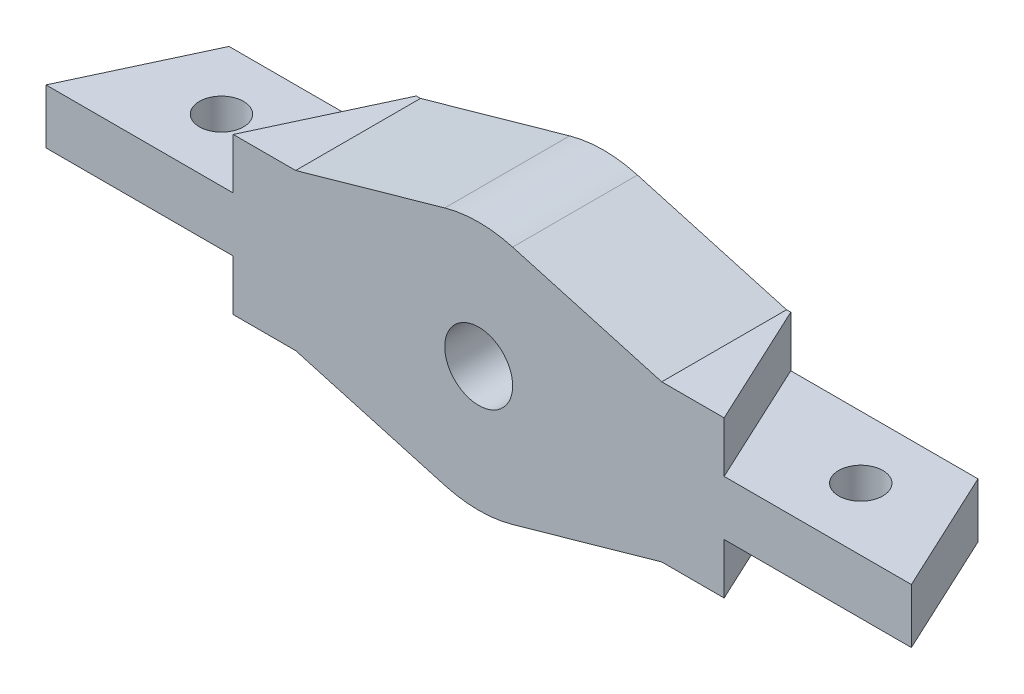
ISO-10303-21;
HEADER;
FILE_DESCRIPTION(('STEP AP214'),'2;1');
FILE_NAME('part.step','',(''),(''),'','','');
FILE_SCHEMA(('AUTOMOTIVE_DESIGN { 1 0 10303 214 1 1 1 1 }'));
ENDSEC;
DATA;
#1=APPLICATION_CONTEXT('core data for automotive mechanical design processes');
#2=APPLICATION_PROTOCOL_DEFINITION('international standard','automotive_design',2000,#1);
#3=PRODUCT_CONTEXT('',#1,'mechanical');
#4=PRODUCT('Part','Part','',(#3));
#5=PRODUCT_RELATED_PRODUCT_CATEGORY('part','',(#4));
#6=PRODUCT_DEFINITION_FORMATION('','',#4);
#7=PRODUCT_DEFINITION_CONTEXT('part definition',#1,'design');
#8=PRODUCT_DEFINITION('design','',#6,#7);
#9=PRODUCT_DEFINITION_SHAPE('','',#8);
#10=(LENGTH_UNIT() NAMED_UNIT(*) SI_UNIT(.MILLI.,.METRE.));
#11=(NAMED_UNIT(*) PLANE_ANGLE_UNIT() SI_UNIT($,.RADIAN.));
#12=(NAMED_UNIT(*) SI_UNIT($,.STERADIAN.) SOLID_ANGLE_UNIT());
#13=UNCERTAINTY_MEASURE_WITH_UNIT(LENGTH_MEASURE(1.E-05),#10,'distance_accuracy_value','');
#14=(GEOMETRIC_REPRESENTATION_CONTEXT(3) GLOBAL_UNCERTAINTY_ASSIGNED_CONTEXT((#13)) GLOBAL_UNIT_ASSIGNED_CONTEXT((#10,
#11,#12)) REPRESENTATION_CONTEXT('',''));
#15=CARTESIAN_POINT('',(0.,0.,0.));
#16=DIRECTION('',(0.,0.,1.));
#17=DIRECTION('',(1.,0.,0.));
#18=AXIS2_PLACEMENT_3D('',#15,#16,#17);
#19=CARTESIAN_POINT('',(24.9721072585685,12.7,6.34999999999999));
#20=DIRECTION('',(0.,0.,-1.));
#21=DIRECTION('',(-1.,0.,0.));
#22=AXIS2_PLACEMENT_3D('',#19,#20,#21);
#23=PLANE('',#22);
#24=CARTESIAN_POINT('',(0.,0.,6.34999999999999));
#25=DIRECTION('',(0.,0.,1.));
#26=DIRECTION('',(1.,0.,0.));
#27=AXIS2_PLACEMENT_3D('',#24,#25,#26);
#28=CIRCLE('',#27,3.4544);
#29=CARTESIAN_POINT('',(3.4544,0.,6.34999999999999));
#30=VERTEX_POINT('',#29);
#31=EDGE_CURVE('E385',#30,#30,#28,.T.);
#32=ORIENTED_EDGE('',*,*,#31,.F.);
#33=EDGE_LOOP('',(#32));
#34=FACE_BOUND('',#33,.T.);
#35=CARTESIAN_POINT('',(0.,0.,6.34999999999999));
#36=DIRECTION('',(0.,0.,-1.));
#37=DIRECTION('',(1.,0.,0.));
#38=AXIS2_PLACEMENT_3D('',#35,#36,#37);
#39=CIRCLE('',#38,12.7);
#40=CARTESIAN_POINT('',(3.45172685795644,-12.2219303589107,6.34999999999999));
#41=VERTEX_POINT('',#40);
#42=CARTESIAN_POINT('',(-3.45172685795644,-12.2219303589107,6.34999999999999));
#43=VERTEX_POINT('',#42);
#44=EDGE_CURVE('E233',#41,#43,#39,.T.);
#45=ORIENTED_EDGE('',*,*,#44,.F.);
#46=DIRECTION('',(-0.962356721174068,-0.271789516374523,0.));
#47=VECTOR('',#46,1.);
#48=CARTESIAN_POINT('',(3.45172685795644,-12.2219303589107,6.34999999999999));
#49=LINE('',#48,#47);
#50=CARTESIAN_POINT('',(18.6221072585685,-7.9375,6.34999999999999));
#51=VERTEX_POINT('',#50);
#52=EDGE_CURVE('E205',#51,#41,#49,.T.);
#53=ORIENTED_EDGE('',*,*,#52,.F.);
#54=DIRECTION('',(-1.,0.,0.));
#55=VECTOR('',#54,1.);
#56=CARTESIAN_POINT('',(0.,-7.9375,6.34999999999999));
#57=LINE('',#56,#55);
#58=CARTESIAN_POINT('',(24.9721072585685,-7.9375,6.34999999999999));
#59=VERTEX_POINT('',#58);
#60=EDGE_CURVE('E185',#59,#51,#57,.T.);
#61=ORIENTED_EDGE('',*,*,#60,.F.);
#62=DIRECTION('',(0.,-1.,0.));
#63=VECTOR('',#62,1.);
#64=CARTESIAN_POINT('',(24.9721072585685,12.7,6.34999999999999));
#65=LINE('',#64,#63);
#66=CARTESIAN_POINT('',(24.9721072585685,-2.778125,6.34999999999999));
#67=VERTEX_POINT('',#66);
#68=EDGE_CURVE('E399',#67,#59,#65,.T.);
#69=ORIENTED_EDGE('',*,*,#68,.F.);
#70=DIRECTION('',(1.,0.,0.));
#71=VECTOR('',#70,1.);
#72=CARTESIAN_POINT('',(24.9721072585685,-2.778125,6.34999999999999));
#73=LINE('',#72,#71);
#74=CARTESIAN_POINT('',(44.0221072585685,-2.778125,6.34999999999999));
#75=VERTEX_POINT('',#74);
#76=EDGE_CURVE('E329',#67,#75,#73,.T.);
#77=ORIENTED_EDGE('',*,*,#76,.T.);
#78=DIRECTION('',(0.,1.,0.));
#79=VECTOR('',#78,1.);
#80=CARTESIAN_POINT('',(44.0221072585685,-2.778125,6.34999999999999));
#81=LINE('',#80,#79);
#82=CARTESIAN_POINT('',(44.0221072585685,2.778125,6.34999999999999));
#83=VERTEX_POINT('',#82);
#84=EDGE_CURVE('E301',#75,#83,#81,.T.);
#85=ORIENTED_EDGE('',*,*,#84,.T.);
#86=DIRECTION('',(-1.,0.,0.));
#87=VECTOR('',#86,1.);
#88=CARTESIAN_POINT('',(24.9721072585685,2.778125,6.34999999999999));
#89=LINE('',#88,#87);
#90=CARTESIAN_POINT('',(24.9721072585685,2.778125,6.34999999999999));
#91=VERTEX_POINT('',#90);
#92=EDGE_CURVE('E316',#83,#91,#89,.T.);
#93=ORIENTED_EDGE('',*,*,#92,.T.);
#94=CARTESIAN_POINT('',(24.9721072585685,7.9375,6.34999999999999));
#95=VERTEX_POINT('',#94);
#96=EDGE_CURVE('E400',#95,#91,#65,.T.);
#97=ORIENTED_EDGE('',*,*,#96,.F.);
#98=DIRECTION('',(-1.,0.,0.));
#99=VECTOR('',#98,1.);
#100=CARTESIAN_POINT('',(0.,7.9375,6.34999999999999));
#101=LINE('',#100,#99);
#102=CARTESIAN_POINT('',(18.6221072585685,7.9375,6.34999999999999));
#103=VERTEX_POINT('',#102);
#104=EDGE_CURVE('E220',#95,#103,#101,.T.);
#105=ORIENTED_EDGE('',*,*,#104,.T.);
#106=DIRECTION('',(-0.962356721174068,0.271789516374523,0.));
#107=VECTOR('',#106,1.);
#108=CARTESIAN_POINT('',(3.45172685795644,12.2219303589107,6.34999999999999));
#109=LINE('',#108,#107);
#110=CARTESIAN_POINT('',(3.45172685795644,12.2219303589107,6.34999999999999));
#111=VERTEX_POINT('',#110);
#112=EDGE_CURVE('E213',#103,#111,#109,.T.);
#113=ORIENTED_EDGE('',*,*,#112,.T.);
#114=CARTESIAN_POINT('',(0.,0.,6.34999999999999));
#115=DIRECTION('',(0.,0.,1.));
#116=DIRECTION('',(1.,0.,0.));
#117=AXIS2_PLACEMENT_3D('',#114,#115,#116);
#118=CIRCLE('',#117,12.7);
#119=CARTESIAN_POINT('',(-3.45172685795644,12.2219303589107,6.34999999999999));
#120=VERTEX_POINT('',#119);
#121=EDGE_CURVE('E261',#111,#120,#118,.T.);
#122=ORIENTED_EDGE('',*,*,#121,.T.);
#123=DIRECTION('',(0.962356721174068,0.271789516374523,0.));
#124=VECTOR('',#123,1.);
#125=CARTESIAN_POINT('',(-3.45172685795644,12.2219303589107,6.34999999999999));
#126=LINE('',#125,#124);
#127=CARTESIAN_POINT('',(-18.6221072585685,7.9375,6.34999999999999));
#128=VERTEX_POINT('',#127);
#129=EDGE_CURVE('E268',#128,#120,#126,.T.);
#130=ORIENTED_EDGE('',*,*,#129,.F.);
#131=DIRECTION('',(1.,0.,0.));
#132=VECTOR('',#131,1.);
#133=CARTESIAN_POINT('',(0.,7.9375,6.34999999999999));
#134=LINE('',#133,#132);
#135=CARTESIAN_POINT('',(-24.9721072585685,7.9375,6.34999999999999));
#136=VERTEX_POINT('',#135);
#137=EDGE_CURVE('E280',#136,#128,#134,.T.);
#138=ORIENTED_EDGE('',*,*,#137,.F.);
#139=DIRECTION('',(0.,-1.,0.));
#140=VECTOR('',#139,1.);
#141=CARTESIAN_POINT('',(-24.9721072585685,12.7,6.35));
#142=LINE('',#141,#140);
#143=CARTESIAN_POINT('',(-24.9721072585685,2.778125,6.35));
#144=VERTEX_POINT('',#143);
#145=EDGE_CURVE('E404',#136,#144,#142,.T.);
#146=ORIENTED_EDGE('',*,*,#145,.T.);
#147=DIRECTION('',(-1.,0.,0.));
#148=VECTOR('',#147,1.);
#149=CARTESIAN_POINT('',(-24.9721072585685,2.778125,6.34999999999999));
#150=LINE('',#149,#148);
#151=CARTESIAN_POINT('',(-44.0221072585685,2.778125,6.35));
#152=VERTEX_POINT('',#151);
#153=EDGE_CURVE('E354',#144,#152,#150,.T.);
#154=ORIENTED_EDGE('',*,*,#153,.T.);
#155=DIRECTION('',(0.,-1.,0.));
#156=VECTOR('',#155,1.);
#157=CARTESIAN_POINT('',(-44.0221072585685,-2.778125,6.34999999999999));
#158=LINE('',#157,#156);
#159=CARTESIAN_POINT('',(-44.0221072585685,-2.778125,6.35));
#160=VERTEX_POINT('',#159);
#161=EDGE_CURVE('E368',#152,#160,#158,.T.);
#162=ORIENTED_EDGE('',*,*,#161,.T.);
#163=DIRECTION('',(1.,0.,0.));
#164=VECTOR('',#163,1.);
#165=CARTESIAN_POINT('',(-24.9721072585685,-2.778125,6.34999999999999));
#166=LINE('',#165,#164);
#167=CARTESIAN_POINT('',(-24.9721072585685,-2.778125,6.35));
#168=VERTEX_POINT('',#167);
#169=EDGE_CURVE('E378',#160,#168,#166,.T.);
#170=ORIENTED_EDGE('',*,*,#169,.T.);
#171=CARTESIAN_POINT('',(-24.9721072585685,-7.9375,6.34999999999999));
#172=VERTEX_POINT('',#171);
#173=EDGE_CURVE('E403',#168,#172,#142,.T.);
#174=ORIENTED_EDGE('',*,*,#173,.T.);
#175=DIRECTION('',(1.,0.,0.));
#176=VECTOR('',#175,1.);
#177=CARTESIAN_POINT('',(0.,-7.9375,6.34999999999999));
#178=LINE('',#177,#176);
#179=CARTESIAN_POINT('',(-18.6221072585685,-7.9375,6.34999999999999));
#180=VERTEX_POINT('',#179);
#181=EDGE_CURVE('E241',#172,#180,#178,.T.);
#182=ORIENTED_EDGE('',*,*,#181,.T.);
#183=DIRECTION('',(0.962356721174068,-0.271789516374523,0.));
#184=VECTOR('',#183,1.);
#185=CARTESIAN_POINT('',(-3.45172685795644,-12.2219303589107,6.34999999999999));
#186=LINE('',#185,#184);
#187=EDGE_CURVE('E251',#180,#43,#186,.T.);
#188=ORIENTED_EDGE('',*,*,#187,.T.);
#189=EDGE_LOOP('',(#45,#53,#61,#69,#77,#85,#93,#97,#105,#113,#122,#130,#138,#146,#154,#162,#170,
#174,#182,#188));
#190=FACE_BOUND('',#189,.T.);
#191=ADVANCED_FACE('F39',(#34,#190),#23,.F.);
#192=CARTESIAN_POINT('',(-19.05,12.7,-6.34999999999999));
#193=DIRECTION('',(0.,0.,1.));
#194=DIRECTION('',(1.,0.,0.));
#195=AXIS2_PLACEMENT_3D('',#192,#193,#194);
#196=PLANE('',#195);
#197=CARTESIAN_POINT('',(0.,0.,-6.34999999999999));
#198=DIRECTION('',(0.,0.,1.));
#199=DIRECTION('',(1.,0.,0.));
#200=AXIS2_PLACEMENT_3D('',#197,#198,#199);
#201=CIRCLE('',#200,3.4544);
#202=CARTESIAN_POINT('',(3.4544,0.,-6.34999999999999));
#203=VERTEX_POINT('',#202);
#204=EDGE_CURVE('E386',#203,#203,#201,.T.);
#205=ORIENTED_EDGE('',*,*,#204,.T.);
#206=EDGE_LOOP('',(#205));
#207=FACE_BOUND('',#206,.T.);
#208=DIRECTION('',(-0.962356721174068,-0.271789516374523,0.));
#209=VECTOR('',#208,1.);
#210=CARTESIAN_POINT('',(3.45172685795644,-12.2219303589107,-6.34999999999999));
#211=LINE('',#210,#209);
#212=CARTESIAN_POINT('',(18.6221072585685,-7.9375,-6.34999999999999));
#213=VERTEX_POINT('',#212);
#214=CARTESIAN_POINT('',(3.45172685795644,-12.2219303589107,-6.34999999999999));
#215=VERTEX_POINT('',#214);
#216=EDGE_CURVE('E191',#213,#215,#211,.T.);
#217=ORIENTED_EDGE('',*,*,#216,.T.);
#218=CARTESIAN_POINT('',(0.,0.,-6.34999999999999));
#219=DIRECTION('',(0.,0.,-1.));
#220=DIRECTION('',(1.,0.,0.));
#221=AXIS2_PLACEMENT_3D('',#218,#219,#220);
#222=CIRCLE('',#221,12.7);
#223=CARTESIAN_POINT('',(-3.45172685795644,-12.2219303589107,-6.34999999999999));
#224=VERTEX_POINT('',#223);
#225=EDGE_CURVE('E237',#215,#224,#222,.T.);
#226=ORIENTED_EDGE('',*,*,#225,.T.);
#227=DIRECTION('',(0.962356721174068,-0.271789516374523,0.));
#228=VECTOR('',#227,1.);
#229=CARTESIAN_POINT('',(-3.45172685795644,-12.2219303589107,-6.34999999999999));
#230=LINE('',#229,#228);
#231=CARTESIAN_POINT('',(-18.6221072585685,-7.9375,-6.34999999999999));
#232=VERTEX_POINT('',#231);
#233=EDGE_CURVE('E240',#232,#224,#230,.T.);
#234=ORIENTED_EDGE('',*,*,#233,.F.);
#235=DIRECTION('',(1.,0.,0.));
#236=VECTOR('',#235,1.);
#237=CARTESIAN_POINT('',(0.,-7.9375,-6.34999999999999));
#238=LINE('',#237,#236);
#239=CARTESIAN_POINT('',(-19.05,-7.9375,-6.34999999999999));
#240=VERTEX_POINT('',#239);
#241=EDGE_CURVE('E244',#240,#232,#238,.T.);
#242=ORIENTED_EDGE('',*,*,#241,.F.);
#243=DIRECTION('',(0.,-1.,0.));
#244=VECTOR('',#243,1.);
#245=CARTESIAN_POINT('',(-19.05,12.7,-6.34999999999999));
#246=LINE('',#245,#244);
#247=CARTESIAN_POINT('',(-19.05,-2.778125,-6.34999999999999));
#248=VERTEX_POINT('',#247);
#249=EDGE_CURVE('E390',#248,#240,#246,.T.);
#250=ORIENTED_EDGE('',*,*,#249,.F.);
#251=DIRECTION('',(1.,0.,0.));
#252=VECTOR('',#251,1.);
#253=CARTESIAN_POINT('',(-19.05,-2.778125,-6.34999999999999));
#254=LINE('',#253,#252);
#255=CARTESIAN_POINT('',(-38.1,-2.778125,-6.34999999999999));
#256=VERTEX_POINT('',#255);
#257=EDGE_CURVE('E357',#256,#248,#254,.T.);
#258=ORIENTED_EDGE('',*,*,#257,.F.);
#259=DIRECTION('',(0.,-1.,0.));
#260=VECTOR('',#259,1.);
#261=CARTESIAN_POINT('',(-38.1,-2.778125,-6.34999999999999));
#262=LINE('',#261,#260);
#263=CARTESIAN_POINT('',(-38.1,2.778125,-6.34999999999999));
#264=VERTEX_POINT('',#263);
#265=EDGE_CURVE('E361',#264,#256,#262,.T.);
#266=ORIENTED_EDGE('',*,*,#265,.F.);
#267=DIRECTION('',(-1.,0.,0.));
#268=VECTOR('',#267,1.);
#269=CARTESIAN_POINT('',(-19.05,2.778125,-6.34999999999999));
#270=LINE('',#269,#268);
#271=CARTESIAN_POINT('',(-19.05,2.778125,-6.34999999999999));
#272=VERTEX_POINT('',#271);
#273=EDGE_CURVE('E349',#272,#264,#270,.T.);
#274=ORIENTED_EDGE('',*,*,#273,.F.);
#275=CARTESIAN_POINT('',(-19.05,7.9375,-6.34999999999999));
#276=VERTEX_POINT('',#275);
#277=EDGE_CURVE('E394',#276,#272,#246,.T.);
#278=ORIENTED_EDGE('',*,*,#277,.F.);
#279=DIRECTION('',(1.,0.,0.));
#280=VECTOR('',#279,1.);
#281=CARTESIAN_POINT('',(0.,7.9375,-6.34999999999999));
#282=LINE('',#281,#280);
#283=CARTESIAN_POINT('',(-18.6221072585685,7.9375,-6.34999999999999));
#284=VERTEX_POINT('',#283);
#285=EDGE_CURVE('E267',#276,#284,#282,.T.);
#286=ORIENTED_EDGE('',*,*,#285,.T.);
#287=DIRECTION('',(0.962356721174068,0.271789516374523,0.));
#288=VECTOR('',#287,1.);
#289=CARTESIAN_POINT('',(-3.45172685795644,12.2219303589107,-6.34999999999999));
#290=LINE('',#289,#288);
#291=CARTESIAN_POINT('',(-3.45172685795644,12.2219303589107,-6.34999999999999));
#292=VERTEX_POINT('',#291);
#293=EDGE_CURVE('E272',#284,#292,#290,.T.);
#294=ORIENTED_EDGE('',*,*,#293,.T.);
#295=CARTESIAN_POINT('',(0.,0.,-6.34999999999999));
#296=DIRECTION('',(0.,0.,1.));
#297=DIRECTION('',(1.,0.,0.));
#298=AXIS2_PLACEMENT_3D('',#295,#296,#297);
#299=CIRCLE('',#298,12.7);
#300=CARTESIAN_POINT('',(3.45172685795644,12.2219303589107,-6.34999999999999));
#301=VERTEX_POINT('',#300);
#302=EDGE_CURVE('E264',#301,#292,#299,.T.);
#303=ORIENTED_EDGE('',*,*,#302,.F.);
#304=DIRECTION('',(-0.962356721174068,0.271789516374523,0.));
#305=VECTOR('',#304,1.);
#306=CARTESIAN_POINT('',(3.45172685795644,12.2219303589107,-6.34999999999999));
#307=LINE('',#306,#305);
#308=CARTESIAN_POINT('',(18.6221072585685,7.9375,-6.34999999999999));
#309=VERTEX_POINT('',#308);
#310=EDGE_CURVE('E215',#309,#301,#307,.T.);
#311=ORIENTED_EDGE('',*,*,#310,.F.);
#312=DIRECTION('',(-1.,0.,0.));
#313=VECTOR('',#312,1.);
#314=CARTESIAN_POINT('',(0.,7.9375,-6.34999999999999));
#315=LINE('',#314,#313);
#316=CARTESIAN_POINT('',(19.05,7.9375,-6.34999999999999));
#317=VERTEX_POINT('',#316);
#318=EDGE_CURVE('E219',#317,#309,#315,.T.);
#319=ORIENTED_EDGE('',*,*,#318,.F.);
#320=DIRECTION('',(0.,-1.,0.));
#321=VECTOR('',#320,1.);
#322=CARTESIAN_POINT('',(19.05,12.7,-6.34999999999999));
#323=LINE('',#322,#321);
#324=CARTESIAN_POINT('',(19.05,2.778125,-6.34999999999999));
#325=VERTEX_POINT('',#324);
#326=EDGE_CURVE('E55',#317,#325,#323,.T.);
#327=ORIENTED_EDGE('',*,*,#326,.T.);
#328=DIRECTION('',(-1.,0.,0.));
#329=VECTOR('',#328,1.);
#330=CARTESIAN_POINT('',(19.05,2.778125,-6.34999999999999));
#331=LINE('',#330,#329);
#332=CARTESIAN_POINT('',(38.1,2.778125,-6.34999999999999));
#333=VERTEX_POINT('',#332);
#334=EDGE_CURVE('E325',#333,#325,#331,.T.);
#335=ORIENTED_EDGE('',*,*,#334,.F.);
#336=DIRECTION('',(0.,1.,0.));
#337=VECTOR('',#336,1.);
#338=CARTESIAN_POINT('',(38.1,-2.778125,-6.34999999999999));
#339=LINE('',#338,#337);
#340=CARTESIAN_POINT('',(38.1,-2.778125,-6.34999999999999));
#341=VERTEX_POINT('',#340);
#342=EDGE_CURVE('E317',#341,#333,#339,.T.);
#343=ORIENTED_EDGE('',*,*,#342,.F.);
#344=DIRECTION('',(1.,0.,0.));
#345=VECTOR('',#344,1.);
#346=CARTESIAN_POINT('',(19.05,-2.778125,-6.34999999999999));
#347=LINE('',#346,#345);
#348=CARTESIAN_POINT('',(19.05,-2.778125,-6.34999999999999));
#349=VERTEX_POINT('',#348);
#350=EDGE_CURVE('E343',#349,#341,#347,.T.);
#351=ORIENTED_EDGE('',*,*,#350,.F.);
#352=CARTESIAN_POINT('',(19.05,-7.9375,-6.34999999999999));
#353=VERTEX_POINT('',#352);
#354=EDGE_CURVE('E203',#349,#353,#323,.T.);
#355=ORIENTED_EDGE('',*,*,#354,.T.);
#356=DIRECTION('',(-1.,0.,0.));
#357=VECTOR('',#356,1.);
#358=CARTESIAN_POINT('',(0.,-7.9375,-6.34999999999999));
#359=LINE('',#358,#357);
#360=EDGE_CURVE('E183',#353,#213,#359,.T.);
#361=ORIENTED_EDGE('',*,*,#360,.T.);
#362=EDGE_LOOP('',(#217,#226,#234,#242,#250,#258,#266,#274,#278,#286,#294,#303,#311,#319,#327,
#335,#343,#351,#355,#361));
#363=FACE_BOUND('',#362,.T.);
#364=ADVANCED_FACE('F201',(#207,#363),#196,.F.);
#365=CARTESIAN_POINT('',(19.05,12.7,-6.34999999999999));
#366=DIRECTION('',(-0.906307787036648,0.,0.422618261740704));
#367=DIRECTION('',(0.422618261740704,0.,0.906307787036648));
#368=AXIS2_PLACEMENT_3D('',#365,#366,#367);
#369=PLANE('',#368);
#370=DIRECTION('',(-0.422618261740704,0.,-0.906307787036648));
#371=VECTOR('',#370,1.);
#372=CARTESIAN_POINT('',(19.05,7.9375,-6.34999999999999));
#373=LINE('',#372,#371);
#374=EDGE_CURVE('E48',#95,#317,#373,.T.);
#375=ORIENTED_EDGE('',*,*,#374,.F.);
#376=ORIENTED_EDGE('',*,*,#96,.T.);
#377=DIRECTION('',(-0.422618261740704,0.,-0.906307787036648));
#378=VECTOR('',#377,1.);
#379=CARTESIAN_POINT('',(24.9721072585685,2.778125,6.34999999999999));
#380=LINE('',#379,#378);
#381=EDGE_CURVE('E335',#91,#325,#380,.T.);
#382=ORIENTED_EDGE('',*,*,#381,.T.);
#383=ORIENTED_EDGE('',*,*,#326,.F.);
#384=EDGE_LOOP('',(#375,#376,#382,#383));
#385=FACE_BOUND('',#384,.T.);
#386=ADVANCED_FACE('F417',(#385),#369,.F.);
#387=CARTESIAN_POINT('',(-24.9721072585685,12.7,6.35));
#388=DIRECTION('',(0.906307787036648,0.,0.422618261740704));
#389=DIRECTION('',(0.422618261740704,0.,-0.906307787036648));
#390=AXIS2_PLACEMENT_3D('',#387,#388,#389);
#391=PLANE('',#390);
#392=DIRECTION('',(0.422618261740704,0.,-0.906307787036648));
#393=VECTOR('',#392,1.);
#394=CARTESIAN_POINT('',(-24.9721072585685,-7.9375,6.35));
#395=LINE('',#394,#393);
#396=EDGE_CURVE('E407',#172,#240,#395,.T.);
#397=ORIENTED_EDGE('',*,*,#396,.F.);
#398=ORIENTED_EDGE('',*,*,#173,.F.);
#399=DIRECTION('',(-0.422618261740704,0.,0.906307787036648));
#400=VECTOR('',#399,1.);
#401=CARTESIAN_POINT('',(-19.05,-2.778125,-6.34999999999999));
#402=LINE('',#401,#400);
#403=EDGE_CURVE('E63',#248,#168,#402,.T.);
#404=ORIENTED_EDGE('',*,*,#403,.F.);
#405=ORIENTED_EDGE('',*,*,#249,.T.);
#406=EDGE_LOOP('',(#397,#398,#404,#405));
#407=FACE_BOUND('',#406,.T.);
#408=ADVANCED_FACE('F437',(#407),#391,.F.);
#409=ORIENTED_EDGE('',*,*,#68,.T.);
#410=DIRECTION('',(-0.422618261740704,0.,-0.906307787036648));
#411=VECTOR('',#410,1.);
#412=CARTESIAN_POINT('',(19.05,-7.9375,-6.34999999999999));
#413=LINE('',#412,#411);
#414=EDGE_CURVE('E11',#59,#353,#413,.T.);
#415=ORIENTED_EDGE('',*,*,#414,.T.);
#416=ORIENTED_EDGE('',*,*,#354,.F.);
#417=DIRECTION('',(-0.422618261740704,0.,-0.906307787036648));
#418=VECTOR('',#417,1.);
#419=CARTESIAN_POINT('',(24.9721072585685,-2.778125,6.34999999999999));
#420=LINE('',#419,#418);
#421=EDGE_CURVE('E339',#67,#349,#420,.T.);
#422=ORIENTED_EDGE('',*,*,#421,.F.);
#423=EDGE_LOOP('',(#409,#415,#416,#422));
#424=FACE_BOUND('',#423,.T.);
#425=ADVANCED_FACE('F432',(#424),#369,.F.);
#426=ORIENTED_EDGE('',*,*,#145,.F.);
#427=DIRECTION('',(0.422618261740704,0.,-0.906307787036648));
#428=VECTOR('',#427,1.);
#429=CARTESIAN_POINT('',(-24.9721072585685,7.9375,6.35));
#430=LINE('',#429,#428);
#431=EDGE_CURVE('E290',#136,#276,#430,.T.);
#432=ORIENTED_EDGE('',*,*,#431,.T.);
#433=ORIENTED_EDGE('',*,*,#277,.T.);
#434=DIRECTION('',(-0.422618261740704,0.,0.906307787036648));
#435=VECTOR('',#434,1.);
#436=CARTESIAN_POINT('',(-19.05,2.778125,-6.34999999999999));
#437=LINE('',#436,#435);
#438=EDGE_CURVE('E350',#272,#144,#437,.T.);
#439=ORIENTED_EDGE('',*,*,#438,.T.);
#440=EDGE_LOOP('',(#426,#432,#433,#439));
#441=FACE_BOUND('',#440,.T.);
#442=ADVANCED_FACE('F41',(#441),#391,.F.);
#443=CARTESIAN_POINT('',(0.,0.,-6.34999999999999));
#444=DIRECTION('',(0.,0.,1.));
#445=DIRECTION('',(1.,0.,0.));
#446=AXIS2_PLACEMENT_3D('',#443,#444,#445);
#447=CYLINDRICAL_SURFACE('',#446,3.4544);
#448=ORIENTED_EDGE('',*,*,#204,.F.);
#449=EDGE_LOOP('',(#448));
#450=FACE_BOUND('',#449,.T.);
#451=ORIENTED_EDGE('',*,*,#31,.T.);
#452=EDGE_LOOP('',(#451));
#453=FACE_BOUND('',#452,.T.);
#454=ADVANCED_FACE('F502',(#450,#453),#447,.F.);
#455=CARTESIAN_POINT('',(-19.05,2.778125,-6.34999999999999));
#456=DIRECTION('',(0.,1.,0.));
#457=DIRECTION('',(-1.,0.,0.));
#458=AXIS2_PLACEMENT_3D('',#455,#456,#457);
#459=PLANE('',#458);
#460=CARTESIAN_POINT('',(-32.520728307402,2.778125,0.));
#461=DIRECTION('',(0.,1.,0.));
#462=DIRECTION('',(-1.,0.,0.));
#463=AXIS2_PLACEMENT_3D('',#460,#461,#462);
#464=CIRCLE('',#463,2.2479);
#465=CARTESIAN_POINT('',(-34.768628307402,2.778125,0.));
#466=VERTEX_POINT('',#465);
#467=EDGE_CURVE('E297',#466,#466,#464,.T.);
#468=ORIENTED_EDGE('',*,*,#467,.F.);
#469=EDGE_LOOP('',(#468));
#470=FACE_BOUND('',#469,.T.);
#471=DIRECTION('',(-0.422618261740704,0.,0.906307787036648));
#472=VECTOR('',#471,1.);
#473=CARTESIAN_POINT('',(-38.1,2.778125,-6.34999999999999));
#474=LINE('',#473,#472);
#475=EDGE_CURVE('E364',#264,#152,#474,.T.);
#476=ORIENTED_EDGE('',*,*,#475,.T.);
#477=ORIENTED_EDGE('',*,*,#153,.F.);
#478=ORIENTED_EDGE('',*,*,#438,.F.);
#479=ORIENTED_EDGE('',*,*,#273,.T.);
#480=EDGE_LOOP('',(#476,#477,#478,#479));
#481=FACE_BOUND('',#480,.T.);
#482=ADVANCED_FACE('F453',(#470,#481),#459,.T.);
#483=CARTESIAN_POINT('',(-38.1,-2.778125,-6.34999999999999));
#484=DIRECTION('',(-0.906307787036648,0.,-0.422618261740704));
#485=DIRECTION('',(-0.422618261740704,0.,0.906307787036648));
#486=AXIS2_PLACEMENT_3D('',#483,#484,#485);
#487=PLANE('',#486);
#488=DIRECTION('',(-0.422618261740704,0.,0.906307787036648));
#489=VECTOR('',#488,1.);
#490=CARTESIAN_POINT('',(-38.1,-2.778125,-6.34999999999999));
#491=LINE('',#490,#489);
#492=EDGE_CURVE('E374',#256,#160,#491,.T.);
#493=ORIENTED_EDGE('',*,*,#492,.T.);
#494=ORIENTED_EDGE('',*,*,#161,.F.);
#495=ORIENTED_EDGE('',*,*,#475,.F.);
#496=ORIENTED_EDGE('',*,*,#265,.T.);
#497=EDGE_LOOP('',(#493,#494,#495,#496));
#498=FACE_BOUND('',#497,.T.);
#499=ADVANCED_FACE('F447',(#498),#487,.T.);
#500=CARTESIAN_POINT('',(-19.05,-2.778125,-6.34999999999999));
#501=DIRECTION('',(0.,-1.,0.));
#502=DIRECTION('',(1.,0.,0.));
#503=AXIS2_PLACEMENT_3D('',#500,#501,#502);
#504=PLANE('',#503);
#505=CARTESIAN_POINT('',(-32.520728307402,-2.778125,0.));
#506=DIRECTION('',(0.,-1.,0.));
#507=DIRECTION('',(1.,0.,0.));
#508=AXIS2_PLACEMENT_3D('',#505,#506,#507);
#509=CIRCLE('',#508,2.2479);
#510=CARTESIAN_POINT('',(-30.272828307402,-2.778125,0.));
#511=VERTEX_POINT('',#510);
#512=EDGE_CURVE('E302',#511,#511,#509,.F.);
#513=ORIENTED_EDGE('',*,*,#512,.T.);
#514=EDGE_LOOP('',(#513));
#515=FACE_BOUND('',#514,.T.);
#516=ORIENTED_EDGE('',*,*,#169,.F.);
#517=ORIENTED_EDGE('',*,*,#492,.F.);
#518=ORIENTED_EDGE('',*,*,#257,.T.);
#519=ORIENTED_EDGE('',*,*,#403,.T.);
#520=EDGE_LOOP('',(#516,#517,#518,#519));
#521=FACE_BOUND('',#520,.T.);
#522=ADVANCED_FACE('F444',(#515,#521),#504,.T.);
#523=CARTESIAN_POINT('',(44.0221072585685,-2.778125,6.34999999999999));
#524=DIRECTION('',(-0.906307787036648,0.,0.422618261740704));
#525=DIRECTION('',(0.422618261740704,0.,0.906307787036648));
#526=AXIS2_PLACEMENT_3D('',#523,#524,#525);
#527=PLANE('',#526);
#528=DIRECTION('',(-0.422618261740704,0.,-0.906307787036648));
#529=VECTOR('',#528,1.);
#530=CARTESIAN_POINT('',(44.0221072585685,2.778125,6.34999999999999));
#531=LINE('',#530,#529);
#532=EDGE_CURVE('E320',#83,#333,#531,.T.);
#533=ORIENTED_EDGE('',*,*,#532,.F.);
#534=ORIENTED_EDGE('',*,*,#84,.F.);
#535=DIRECTION('',(-0.422618261740704,0.,-0.906307787036648));
#536=VECTOR('',#535,1.);
#537=CARTESIAN_POINT('',(44.0221072585685,-2.778125,6.34999999999999));
#538=LINE('',#537,#536);
#539=EDGE_CURVE('E321',#75,#341,#538,.T.);
#540=ORIENTED_EDGE('',*,*,#539,.T.);
#541=ORIENTED_EDGE('',*,*,#342,.T.);
#542=EDGE_LOOP('',(#533,#534,#540,#541));
#543=FACE_BOUND('',#542,.T.);
#544=ADVANCED_FACE('F425',(#543),#527,.F.);
#545=CARTESIAN_POINT('',(24.9721072585685,2.778125,6.34999999999999));
#546=DIRECTION('',(0.,-1.,0.));
#547=DIRECTION('',(1.,0.,0.));
#548=AXIS2_PLACEMENT_3D('',#545,#546,#547);
#549=PLANE('',#548);
#550=CARTESIAN_POINT('',(32.520728307402,2.778125,0.));
#551=DIRECTION('',(0.,1.,0.));
#552=DIRECTION('',(1.,0.,0.));
#553=AXIS2_PLACEMENT_3D('',#550,#551,#552);
#554=CIRCLE('',#553,2.2479);
#555=CARTESIAN_POINT('',(34.768628307402,2.778125,0.));
#556=VERTEX_POINT('',#555);
#557=EDGE_CURVE('E296',#556,#556,#554,.T.);
#558=ORIENTED_EDGE('',*,*,#557,.F.);
#559=EDGE_LOOP('',(#558));
#560=FACE_BOUND('',#559,.T.);
#561=ORIENTED_EDGE('',*,*,#381,.F.);
#562=ORIENTED_EDGE('',*,*,#92,.F.);
#563=ORIENTED_EDGE('',*,*,#532,.T.);
#564=ORIENTED_EDGE('',*,*,#334,.T.);
#565=EDGE_LOOP('',(#561,#562,#563,#564));
#566=FACE_BOUND('',#565,.T.);
#567=ADVANCED_FACE('F420',(#560,#566),#549,.F.);
#568=CARTESIAN_POINT('',(24.9721072585685,-2.778125,6.34999999999999));
#569=DIRECTION('',(0.,1.,0.));
#570=DIRECTION('',(-1.,0.,0.));
#571=AXIS2_PLACEMENT_3D('',#568,#569,#570);
#572=PLANE('',#571);
#573=CARTESIAN_POINT('',(32.520728307402,-2.778125,0.));
#574=DIRECTION('',(0.,1.,0.));
#575=DIRECTION('',(-1.,0.,0.));
#576=AXIS2_PLACEMENT_3D('',#573,#574,#575);
#577=CIRCLE('',#576,2.2479);
#578=CARTESIAN_POINT('',(30.272828307402,-2.778125,0.));
#579=VERTEX_POINT('',#578);
#580=EDGE_CURVE('E306',#579,#579,#577,.F.);
#581=ORIENTED_EDGE('',*,*,#580,.F.);
#582=EDGE_LOOP('',(#581));
#583=FACE_BOUND('',#582,.T.);
#584=ORIENTED_EDGE('',*,*,#350,.T.);
#585=ORIENTED_EDGE('',*,*,#539,.F.);
#586=ORIENTED_EDGE('',*,*,#76,.F.);
#587=ORIENTED_EDGE('',*,*,#421,.T.);
#588=EDGE_LOOP('',(#584,#585,#586,#587));
#589=FACE_BOUND('',#588,.T.);
#590=ADVANCED_FACE('F427',(#583,#589),#572,.F.);
#591=CARTESIAN_POINT('',(32.520728307402,-12.701,0.));
#592=DIRECTION('',(0.,1.,0.));
#593=DIRECTION('',(-1.,0.,0.));
#594=AXIS2_PLACEMENT_3D('',#591,#592,#593);
#595=CYLINDRICAL_SURFACE('',#594,2.2479);
#596=ORIENTED_EDGE('',*,*,#557,.T.);
#597=EDGE_LOOP('',(#596));
#598=FACE_BOUND('',#597,.T.);
#599=ORIENTED_EDGE('',*,*,#580,.T.);
#600=EDGE_LOOP('',(#599));
#601=FACE_BOUND('',#600,.T.);
#602=ADVANCED_FACE('F516',(#598,#601),#595,.F.);
#603=CARTESIAN_POINT('',(-32.520728307402,-12.701,0.));
#604=DIRECTION('',(0.,1.,0.));
#605=DIRECTION('',(-1.,0.,0.));
#606=AXIS2_PLACEMENT_3D('',#603,#604,#605);
#607=CYLINDRICAL_SURFACE('',#606,2.2479);
#608=ORIENTED_EDGE('',*,*,#512,.F.);
#609=EDGE_LOOP('',(#608));
#610=FACE_BOUND('',#609,.T.);
#611=ORIENTED_EDGE('',*,*,#467,.T.);
#612=EDGE_LOOP('',(#611));
#613=FACE_BOUND('',#612,.T.);
#614=ADVANCED_FACE('F525',(#610,#613),#607,.F.);
#615=CARTESIAN_POINT('',(0.,7.9375,-6.34999999999999));
#616=DIRECTION('',(0.,-1.,0.));
#617=DIRECTION('',(0.,0.,-1.));
#618=AXIS2_PLACEMENT_3D('',#615,#616,#617);
#619=PLANE('',#618);
#620=ORIENTED_EDGE('',*,*,#137,.T.);
#621=DIRECTION('',(0.,0.,1.));
#622=VECTOR('',#621,1.);
#623=CARTESIAN_POINT('',(-18.6221072585685,7.9375,-6.34999999999999));
#624=LINE('',#623,#622);
#625=EDGE_CURVE('E276',#284,#128,#624,.T.);
#626=ORIENTED_EDGE('',*,*,#625,.F.);
#627=ORIENTED_EDGE('',*,*,#285,.F.);
#628=ORIENTED_EDGE('',*,*,#431,.F.);
#629=EDGE_LOOP('',(#620,#626,#627,#628));
#630=FACE_BOUND('',#629,.T.);
#631=ADVANCED_FACE('F459',(#630),#619,.F.);
#632=CARTESIAN_POINT('',(0.,0.,-6.34999999999999));
#633=DIRECTION('',(0.,0.,1.));
#634=DIRECTION('',(1.,0.,0.));
#635=AXIS2_PLACEMENT_3D('',#632,#633,#634);
#636=CYLINDRICAL_SURFACE('',#635,12.7);
#637=ORIENTED_EDGE('',*,*,#121,.F.);
#638=DIRECTION('',(0.,0.,1.));
#639=VECTOR('',#638,1.);
#640=CARTESIAN_POINT('',(3.45172685795644,12.2219303589107,-6.34999999999999));
#641=LINE('',#640,#639);
#642=EDGE_CURVE('E223',#301,#111,#641,.T.);
#643=ORIENTED_EDGE('',*,*,#642,.F.);
#644=ORIENTED_EDGE('',*,*,#302,.T.);
#645=DIRECTION('',(0.,0.,1.));
#646=VECTOR('',#645,1.);
#647=CARTESIAN_POINT('',(-3.45172685795644,12.2219303589107,-6.34999999999999));
#648=LINE('',#647,#646);
#649=EDGE_CURVE('E287',#292,#120,#648,.T.);
#650=ORIENTED_EDGE('',*,*,#649,.T.);
#651=EDGE_LOOP('',(#637,#643,#644,#650));
#652=FACE_BOUND('',#651,.T.);
#653=ADVANCED_FACE('F466',(#652),#636,.T.);
#654=CARTESIAN_POINT('',(-3.45172685795644,12.2219303589107,-6.34999999999999));
#655=DIRECTION('',(0.271789516374523,-0.962356721174068,0.));
#656=DIRECTION('',(0.962356721174068,0.271789516374523,0.));
#657=AXIS2_PLACEMENT_3D('',#654,#655,#656);
#658=PLANE('',#657);
#659=ORIENTED_EDGE('',*,*,#129,.T.);
#660=ORIENTED_EDGE('',*,*,#649,.F.);
#661=ORIENTED_EDGE('',*,*,#293,.F.);
#662=ORIENTED_EDGE('',*,*,#625,.T.);
#663=EDGE_LOOP('',(#659,#660,#661,#662));
#664=FACE_BOUND('',#663,.T.);
#665=ADVANCED_FACE('F464',(#664),#658,.F.);
#666=CARTESIAN_POINT('',(0.,-7.9375,-6.34999999999999));
#667=DIRECTION('',(0.,-1.,0.));
#668=DIRECTION('',(0.,0.,-1.));
#669=AXIS2_PLACEMENT_3D('',#666,#667,#668);
#670=PLANE('',#669);
#671=ORIENTED_EDGE('',*,*,#396,.T.);
#672=ORIENTED_EDGE('',*,*,#241,.T.);
#673=DIRECTION('',(0.,0.,1.));
#674=VECTOR('',#673,1.);
#675=CARTESIAN_POINT('',(-18.6221072585685,-7.9375,-6.34999999999999));
#676=LINE('',#675,#674);
#677=EDGE_CURVE('E258',#232,#180,#676,.T.);
#678=ORIENTED_EDGE('',*,*,#677,.T.);
#679=ORIENTED_EDGE('',*,*,#181,.F.);
#680=EDGE_LOOP('',(#671,#672,#678,#679));
#681=FACE_BOUND('',#680,.T.);
#682=ADVANCED_FACE('F475',(#681),#670,.T.);
#683=CARTESIAN_POINT('',(0.,0.,-6.34999999999999));
#684=DIRECTION('',(0.,0.,1.));
#685=DIRECTION('',(1.,0.,0.));
#686=AXIS2_PLACEMENT_3D('',#683,#684,#685);
#687=CYLINDRICAL_SURFACE('',#686,12.7);
#688=ORIENTED_EDGE('',*,*,#44,.T.);
#689=DIRECTION('',(0.,0.,1.));
#690=VECTOR('',#689,1.);
#691=CARTESIAN_POINT('',(-3.45172685795644,-12.2219303589107,-6.34999999999999));
#692=LINE('',#691,#690);
#693=EDGE_CURVE('E247',#224,#43,#692,.T.);
#694=ORIENTED_EDGE('',*,*,#693,.F.);
#695=ORIENTED_EDGE('',*,*,#225,.F.);
#696=DIRECTION('',(0.,0.,1.));
#697=VECTOR('',#696,1.);
#698=CARTESIAN_POINT('',(3.45172685795644,-12.2219303589107,-6.34999999999999));
#699=LINE('',#698,#697);
#700=EDGE_CURVE('E190',#215,#41,#699,.T.);
#701=ORIENTED_EDGE('',*,*,#700,.T.);
#702=EDGE_LOOP('',(#688,#694,#695,#701));
#703=FACE_BOUND('',#702,.T.);
#704=ADVANCED_FACE('F481',(#703),#687,.T.);
#705=CARTESIAN_POINT('',(-3.45172685795644,-12.2219303589107,-6.34999999999999));
#706=DIRECTION('',(-0.271789516374523,-0.962356721174068,0.));
#707=DIRECTION('',(0.962356721174068,-0.271789516374523,0.));
#708=AXIS2_PLACEMENT_3D('',#705,#706,#707);
#709=PLANE('',#708);
#710=ORIENTED_EDGE('',*,*,#187,.F.);
#711=ORIENTED_EDGE('',*,*,#677,.F.);
#712=ORIENTED_EDGE('',*,*,#233,.T.);
#713=ORIENTED_EDGE('',*,*,#693,.T.);
#714=EDGE_LOOP('',(#710,#711,#712,#713));
#715=FACE_BOUND('',#714,.T.);
#716=ADVANCED_FACE('F478',(#715),#709,.T.);
#717=CARTESIAN_POINT('',(0.,7.9375,-6.34999999999999));
#718=DIRECTION('',(0.,1.,0.));
#719=DIRECTION('',(0.,0.,1.));
#720=AXIS2_PLACEMENT_3D('',#717,#718,#719);
#721=PLANE('',#720);
#722=ORIENTED_EDGE('',*,*,#374,.T.);
#723=ORIENTED_EDGE('',*,*,#318,.T.);
#724=DIRECTION('',(0.,0.,1.));
#725=VECTOR('',#724,1.);
#726=CARTESIAN_POINT('',(18.6221072585685,7.9375,-6.34999999999999));
#727=LINE('',#726,#725);
#728=EDGE_CURVE('E230',#309,#103,#727,.T.);
#729=ORIENTED_EDGE('',*,*,#728,.T.);
#730=ORIENTED_EDGE('',*,*,#104,.F.);
#731=EDGE_LOOP('',(#722,#723,#729,#730));
#732=FACE_BOUND('',#731,.T.);
#733=ADVANCED_FACE('F412',(#732),#721,.T.);
#734=CARTESIAN_POINT('',(3.45172685795644,12.2219303589107,-6.34999999999999));
#735=DIRECTION('',(0.271789516374523,0.962356721174068,0.));
#736=DIRECTION('',(-0.962356721174068,0.271789516374523,0.));
#737=AXIS2_PLACEMENT_3D('',#734,#735,#736);
#738=PLANE('',#737);
#739=ORIENTED_EDGE('',*,*,#112,.F.);
#740=ORIENTED_EDGE('',*,*,#728,.F.);
#741=ORIENTED_EDGE('',*,*,#310,.T.);
#742=ORIENTED_EDGE('',*,*,#642,.T.);
#743=EDGE_LOOP('',(#739,#740,#741,#742));
#744=FACE_BOUND('',#743,.T.);
#745=ADVANCED_FACE('F470',(#744),#738,.T.);
#746=CARTESIAN_POINT('',(0.,-7.9375,-6.34999999999999));
#747=DIRECTION('',(0.,1.,0.));
#748=DIRECTION('',(0.,0.,1.));
#749=AXIS2_PLACEMENT_3D('',#746,#747,#748);
#750=PLANE('',#749);
#751=ORIENTED_EDGE('',*,*,#60,.T.);
#752=DIRECTION('',(0.,0.,1.));
#753=VECTOR('',#752,1.);
#754=CARTESIAN_POINT('',(18.6221072585685,-7.9375,-6.34999999999999));
#755=LINE('',#754,#753);
#756=EDGE_CURVE('E179',#213,#51,#755,.T.);
#757=ORIENTED_EDGE('',*,*,#756,.F.);
#758=ORIENTED_EDGE('',*,*,#360,.F.);
#759=ORIENTED_EDGE('',*,*,#414,.F.);
#760=EDGE_LOOP('',(#751,#757,#758,#759));
#761=FACE_BOUND('',#760,.T.);
#762=ADVANCED_FACE('F181',(#761),#750,.F.);
#763=CARTESIAN_POINT('',(3.45172685795644,-12.2219303589107,-6.34999999999999));
#764=DIRECTION('',(-0.271789516374523,0.962356721174068,0.));
#765=DIRECTION('',(-0.962356721174068,-0.271789516374523,0.));
#766=AXIS2_PLACEMENT_3D('',#763,#764,#765);
#767=PLANE('',#766);
#768=ORIENTED_EDGE('',*,*,#52,.T.);
#769=ORIENTED_EDGE('',*,*,#700,.F.);
#770=ORIENTED_EDGE('',*,*,#216,.F.);
#771=ORIENTED_EDGE('',*,*,#756,.T.);
#772=EDGE_LOOP('',(#768,#769,#770,#771));
#773=FACE_BOUND('',#772,.T.);
#774=ADVANCED_FACE('F195',(#773),#767,.F.);
#775=CLOSED_SHELL('',(#191,#364,#386,#408,#425,#442,#454,#482,#499,#522,#544,#567,#590,#602,
#614,#631,#653,#665,#682,#704,#716,#733,#745,#762,#774));
#776=MANIFOLD_SOLID_BREP('B2',#775);
#777=ADVANCED_BREP_SHAPE_REPRESENTATION('',(#18,#776),#14);
#778=SHAPE_DEFINITION_REPRESENTATION(#9,#777);
ENDSEC;
END-ISO-10303-21;
